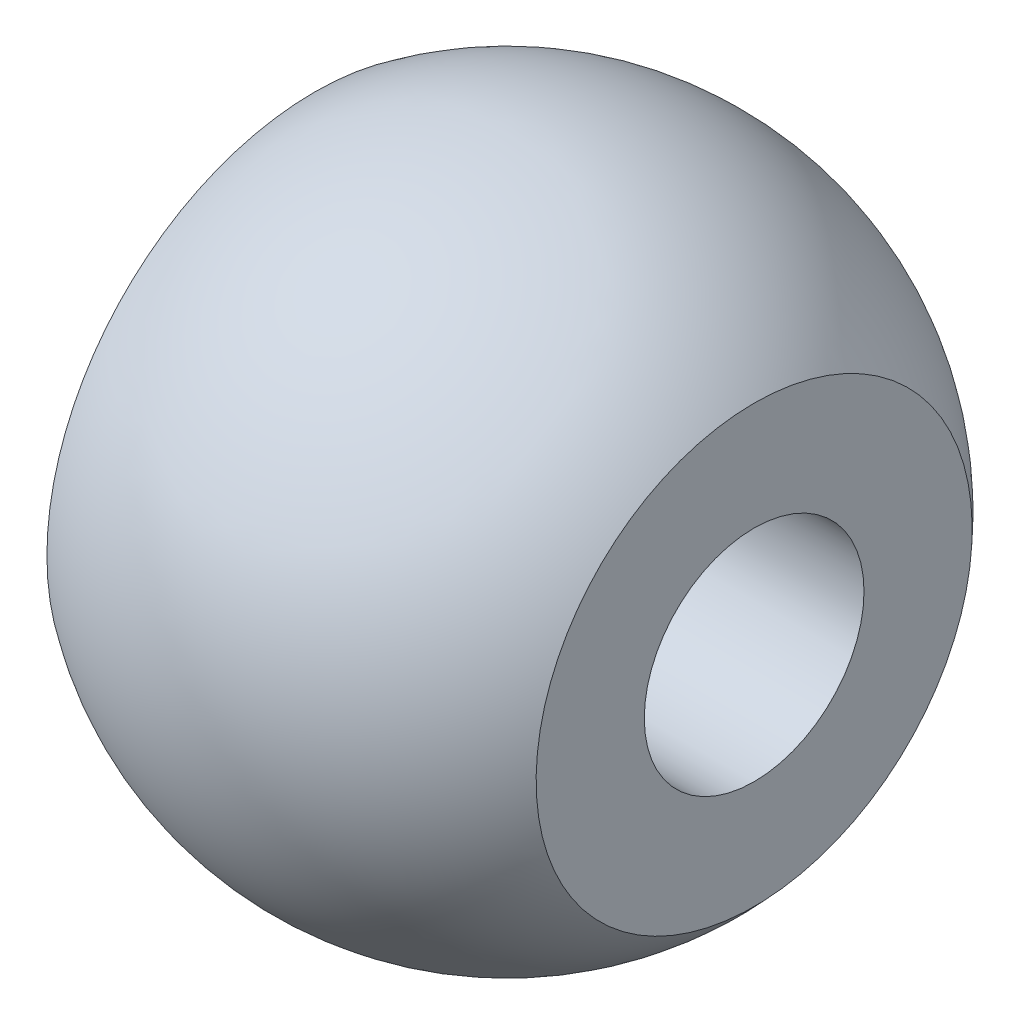
ISO-10303-21;
HEADER;
FILE_DESCRIPTION(('STEP AP214'),'2;1');
FILE_NAME('part.step','',(''),(''),'','','');
FILE_SCHEMA(('AUTOMOTIVE_DESIGN { 1 0 10303 214 1 1 1 1 }'));
ENDSEC;
DATA;
#1=APPLICATION_CONTEXT('core data for automotive mechanical design processes');
#2=APPLICATION_PROTOCOL_DEFINITION('international standard','automotive_design',2000,#1);
#3=PRODUCT_CONTEXT('',#1,'mechanical');
#4=PRODUCT('Part','Part','',(#3));
#5=PRODUCT_RELATED_PRODUCT_CATEGORY('part','',(#4));
#6=PRODUCT_DEFINITION_FORMATION('','',#4);
#7=PRODUCT_DEFINITION_CONTEXT('part definition',#1,'design');
#8=PRODUCT_DEFINITION('design','',#6,#7);
#9=PRODUCT_DEFINITION_SHAPE('','',#8);
#10=(LENGTH_UNIT() NAMED_UNIT(*) SI_UNIT(.MILLI.,.METRE.));
#11=(NAMED_UNIT(*) PLANE_ANGLE_UNIT() SI_UNIT($,.RADIAN.));
#12=(NAMED_UNIT(*) SI_UNIT($,.STERADIAN.) SOLID_ANGLE_UNIT());
#13=UNCERTAINTY_MEASURE_WITH_UNIT(LENGTH_MEASURE(1.E-05),#10,'distance_accuracy_value','');
#14=(GEOMETRIC_REPRESENTATION_CONTEXT(3) GLOBAL_UNCERTAINTY_ASSIGNED_CONTEXT((#13)) GLOBAL_UNIT_ASSIGNED_CONTEXT((#10,
#11,#12)) REPRESENTATION_CONTEXT('',''));
#15=CARTESIAN_POINT('',(0.,0.,0.));
#16=DIRECTION('',(0.,0.,1.));
#17=DIRECTION('',(1.,0.,0.));
#18=AXIS2_PLACEMENT_3D('',#15,#16,#17);
#19=CARTESIAN_POINT('',(4.5,0.,0.));
#20=DIRECTION('',(1.,0.,0.));
#21=DIRECTION('',(0.,0.,-1.));
#22=AXIS2_PLACEMENT_3D('',#19,#20,#21);
#23=PLANE('',#22);
#24=CARTESIAN_POINT('',(4.5,0.,0.));
#25=DIRECTION('',(-1.,0.,0.));
#26=DIRECTION('',(0.,0.,1.));
#27=AXIS2_PLACEMENT_3D('',#24,#25,#26);
#28=CIRCLE('',#27,2.);
#29=CARTESIAN_POINT('',(4.5,0.,2.));
#30=VERTEX_POINT('',#29);
#31=EDGE_CURVE('E51',#30,#30,#28,.T.);
#32=ORIENTED_EDGE('',*,*,#31,.T.);
#33=EDGE_LOOP('',(#32));
#34=FACE_BOUND('',#33,.T.);
#35=CARTESIAN_POINT('',(4.5,0.,0.));
#36=DIRECTION('',(-1.,0.,0.));
#37=DIRECTION('',(0.,0.,1.));
#38=AXIS2_PLACEMENT_3D('',#35,#36,#37);
#39=CIRCLE('',#38,3.96862696659689);
#40=CARTESIAN_POINT('',(4.5,3.96862696659689,0.));
#41=VERTEX_POINT('',#40);
#42=EDGE_CURVE('E10',#41,#41,#39,.T.);
#43=ORIENTED_EDGE('',*,*,#42,.F.);
#44=EDGE_LOOP('',(#43));
#45=FACE_BOUND('',#44,.T.);
#46=ADVANCED_FACE('F37',(#34,#45),#23,.T.);
#47=CARTESIAN_POINT('',(0.,0.,0.));
#48=DIRECTION('',(-1.,0.,0.));
#49=DIRECTION('',(0.,1.,0.));
#50=AXIS2_PLACEMENT_3D('',#47,#48,#49);
#51=SPHERICAL_SURFACE('',#50,6.);
#52=CARTESIAN_POINT('',(-3.5,0.,0.));
#53=DIRECTION('',(-1.,0.,0.));
#54=DIRECTION('',(0.,0.,1.));
#55=AXIS2_PLACEMENT_3D('',#52,#53,#54);
#56=CIRCLE('',#55,4.87339717240448);
#57=CARTESIAN_POINT('',(-3.5,4.87339717240448,0.));
#58=VERTEX_POINT('',#57);
#59=EDGE_CURVE('E43',#58,#58,#56,.T.);
#60=CARTESIAN_POINT('',(-3.5,4.87339717240448,0.));
#61=CARTESIAN_POINT('',(-3.42533186931101,4.92702466396353,0.));
#62=CARTESIAN_POINT('',(-3.34942953702069,4.97893343549644,0.));
#63=CARTESIAN_POINT('',(-3.19532064681178,5.07920978436402,0.));
#64=CARTESIAN_POINT('',(-3.1171140888932,5.12757736169868,0.));
#65=CARTESIAN_POINT('',(-2.95856092500217,5.22066756802382,0.));
#66=CARTESIAN_POINT('',(-2.87821431902972,5.26539019701428,0.));
#67=CARTESIAN_POINT('',(-2.7155510615653,5.35109645662291,0.));
#68=CARTESIAN_POINT('',(-2.63323441007333,5.39208008724108,0.));
#69=CARTESIAN_POINT('',(-2.46680487622308,5.47022166138629,0.));
#70=CARTESIAN_POINT('',(-2.38269199386479,5.50737960491333,0.));
#71=CARTESIAN_POINT('',(-2.21284770099542,5.57779134157929,0.));
#72=CARTESIAN_POINT('',(-2.12711629048433,5.6110451347182,0.));
#73=CARTESIAN_POINT('',(-1.954216037966,5.67357831601095,0.));
#74=CARTESIAN_POINT('',(-1.86704719595877,5.7028577041648,0.));
#75=CARTESIAN_POINT('',(-1.69145622030728,5.75738022689156,0.));
#76=CARTESIAN_POINT('',(-1.60303408666303,5.78262336146448,0.));
#77=CARTESIAN_POINT('',(-1.42512331329127,5.82902005198489,0.));
#78=CARTESIAN_POINT('',(-1.33563467356375,5.85017360793238,0.));
#79=CARTESIAN_POINT('',(-1.15577992698574,5.8883464558648,0.));
#80=CARTESIAN_POINT('',(-1.06541382013525,5.90536574784972,0.));
#81=CARTESIAN_POINT('',(-0.883995031733778,5.93523411568146,0.));
#82=CARTESIAN_POINT('',(-0.792942350182797,5.94808319152827,0.));
#83=CARTESIAN_POINT('',(-0.610342755181318,5.96958398426847,0.));
#84=CARTESIAN_POINT('',(-0.51879584173082,5.97823570116186,0.));
#85=CARTESIAN_POINT('',(-0.335401169754338,5.99132349980999,0.));
#86=CARTESIAN_POINT('',(-0.243553411228354,5.99575958156474,0.));
#87=CARTESIAN_POINT('',(-0.059751071442828,6.00040673900583,0.));
#88=CARTESIAN_POINT('',(0.032203509816714,6.00061781469217,0.));
#89=CARTESIAN_POINT('',(0.216025247072104,5.99681451411275,0.));
#90=CARTESIAN_POINT('',(0.307892403067952,5.99280013784698,0.));
#91=CARTESIAN_POINT('',(0.491345226478636,5.9805544134689,0.));
#92=CARTESIAN_POINT('',(0.582930893893473,5.97232306535658,0.));
#93=CARTESIAN_POINT('',(0.765627271450951,5.95166078546621,0.));
#94=CARTESIAN_POINT('',(0.856737981593592,5.93922985368815,0.));
#95=CARTESIAN_POINT('',(1.03829197923146,5.91019466599108,0.));
#96=CARTESIAN_POINT('',(1.12873526672669,5.89359041007206,0.));
#97=CARTESIAN_POINT('',(1.30876336358084,5.85624364949019,0.));
#98=CARTESIAN_POINT('',(1.39834817293976,5.83550114482734,0.));
#99=CARTESIAN_POINT('',(1.57647007151118,5.78992170393312,0.));
#100=CARTESIAN_POINT('',(1.66500716072368,5.76508476770176,0.));
#101=CARTESIAN_POINT('',(1.84084659023105,5.71136893006205,0.));
#102=CARTESIAN_POINT('',(1.92814893052593,5.68249002865369,0.));
#103=CARTESIAN_POINT('',(2.10133444175594,5.62075126543995,0.));
#104=CARTESIAN_POINT('',(2.18721761269107,5.58789140363456,0.));
#105=CARTESIAN_POINT('',(2.35738336264901,5.51826013391155,0.));
#106=CARTESIAN_POINT('',(2.44166594167183,5.48148872599392,0.));
#107=CARTESIAN_POINT('',(2.60845246644329,5.40411204125897,0.));
#108=CARTESIAN_POINT('',(2.69095641219193,5.36350676444165,0.));
#109=CARTESIAN_POINT('',(2.85401138612835,5.27854811775057,0.));
#110=CARTESIAN_POINT('',(2.93456241431613,5.23419474787681,0.));
#111=CARTESIAN_POINT('',(3.09354139489009,5.14183360913115,0.));
#112=CARTESIAN_POINT('',(3.17196934727627,5.09382584025926,0.));
#113=CARTESIAN_POINT('',(3.32653650048984,4.99425731495659,0.));
#114=CARTESIAN_POINT('',(3.40267570131722,4.94269655852582,0.));
#115=CARTESIAN_POINT('',(3.5525045193538,4.83613098356667,0.));
#116=CARTESIAN_POINT('',(3.626194136563,4.7811261650383,0.));
#117=CARTESIAN_POINT('',(3.77096809681874,4.6677886347168,0.));
#118=CARTESIAN_POINT('',(3.84205243986527,4.60945592292367,0.));
#119=CARTESIAN_POINT('',(3.98146578813715,4.48958592422232,0.));
#120=CARTESIAN_POINT('',(4.04979479336251,4.42804863731411,0.));
#121=CARTESIAN_POINT('',(4.18355276220888,4.30189913052314,0.));
#122=CARTESIAN_POINT('',(4.2489817258299,4.23728691064039,0.));
#123=CARTESIAN_POINT('',(4.3768027527929,4.10512533812495,0.));
#124=CARTESIAN_POINT('',(4.43919481613488,4.03757598549225,0.));
#125=CARTESIAN_POINT('',(4.5,3.96862696659689,0.));
#126=B_SPLINE_CURVE_WITH_KNOTS('',3,(#60,#61,#62,#63,#64,#65,#66,#67,#68,#69,#70,#71,#72,#73,
#74,#75,#76,#77,#78,#79,#80,#81,#82,#83,#84,#85,#86,#87,#88,#89,#90,#91,#92,#93,#94,#95,#96,#97,
#98,#99,#100,#101,#102,#103,#104,#105,#106,#107,#108,#109,#110,#111,#112,#113,#114,#115,#116,
#117,#118,#119,#120,#121,#122,#123,#124,#125),.UNSPECIFIED.,.F.,.F.,(4,2,2,2,2,2,2,2,2,2,2,2,2,
2,2,2,2,2,2,2,2,2,2,2,2,2,2,2,2,2,2,2,4),(0.,0.275767346288678,0.551534692577356,
0.827302038866034,1.10306938515471,1.37883673144339,1.65460407773207,1.93037142402075,
2.20613877030942,2.4819061165981,2.75767346288678,3.03344080917546,3.30920815546414,
3.58497550175281,3.86074284804149,4.13651019433017,4.41227754061885,4.68804488690753,
4.9638122331962,5.23957957948488,5.51534692577356,5.79111427206224,6.06688161835091,
6.34264896463959,6.61841631092827,6.89418365721695,7.16995100350563,7.4457183497943,
7.72148569608298,7.99725304237166,8.27302038866034,8.54878773494902,8.82455508123769),.UNSPECIFIED.);
#127=EDGE_CURVE('BSEAM67',#58,#41,#126,.T.);
#128=ORIENTED_EDGE('',*,*,#59,.F.);
#129=ORIENTED_EDGE('',*,*,#42,.T.);
#130=ORIENTED_EDGE('',*,*,#127,.T.);
#131=ORIENTED_EDGE('',*,*,#127,.F.);
#132=EDGE_LOOP('',(#128,#130,#129,#131));
#133=FACE_BOUND('',#132,.T.);
#134=ADVANCED_FACE('F67',(#133),#51,.T.);
#135=CARTESIAN_POINT('',(-1.84104336902354,0.,0.));
#136=DIRECTION('',(-1.,0.,0.));
#137=DIRECTION('',(0.,0.,1.));
#138=AXIS2_PLACEMENT_3D('',#135,#136,#137);
#139=CONICAL_SURFACE('',#138,2.,1.04719755119659);
#140=ORIENTED_EDGE('',*,*,#59,.T.);
#141=EDGE_LOOP('',(#140));
#142=FACE_BOUND('',#141,.T.);
#143=CARTESIAN_POINT('',(-1.84104336902354,0.,0.));
#144=DIRECTION('',(-1.,0.,0.));
#145=DIRECTION('',(0.,0.,1.));
#146=AXIS2_PLACEMENT_3D('',#143,#144,#145);
#147=CIRCLE('',#146,2.);
#148=CARTESIAN_POINT('',(-1.84104336902354,0.,2.));
#149=VERTEX_POINT('',#148);
#150=EDGE_CURVE('E47',#149,#149,#147,.T.);
#151=ORIENTED_EDGE('',*,*,#150,.F.);
#152=EDGE_LOOP('',(#151));
#153=FACE_BOUND('',#152,.T.);
#154=ADVANCED_FACE('F61',(#142,#153),#139,.F.);
#155=CARTESIAN_POINT('',(0.,0.,0.));
#156=DIRECTION('',(-1.,0.,0.));
#157=DIRECTION('',(0.,0.,1.));
#158=AXIS2_PLACEMENT_3D('',#155,#156,#157);
#159=CYLINDRICAL_SURFACE('',#158,2.);
#160=ORIENTED_EDGE('',*,*,#150,.T.);
#161=EDGE_LOOP('',(#160));
#162=FACE_BOUND('',#161,.T.);
#163=ORIENTED_EDGE('',*,*,#31,.F.);
#164=EDGE_LOOP('',(#163));
#165=FACE_BOUND('',#164,.T.);
#166=ADVANCED_FACE('F59',(#162,#165),#159,.F.);
#167=CLOSED_SHELL('',(#46,#134,#154,#166));
#168=MANIFOLD_SOLID_BREP('B2',#167);
#169=ADVANCED_BREP_SHAPE_REPRESENTATION('',(#18,#168),#14);
#170=SHAPE_DEFINITION_REPRESENTATION(#9,#169);
ENDSEC;
END-ISO-10303-21;
